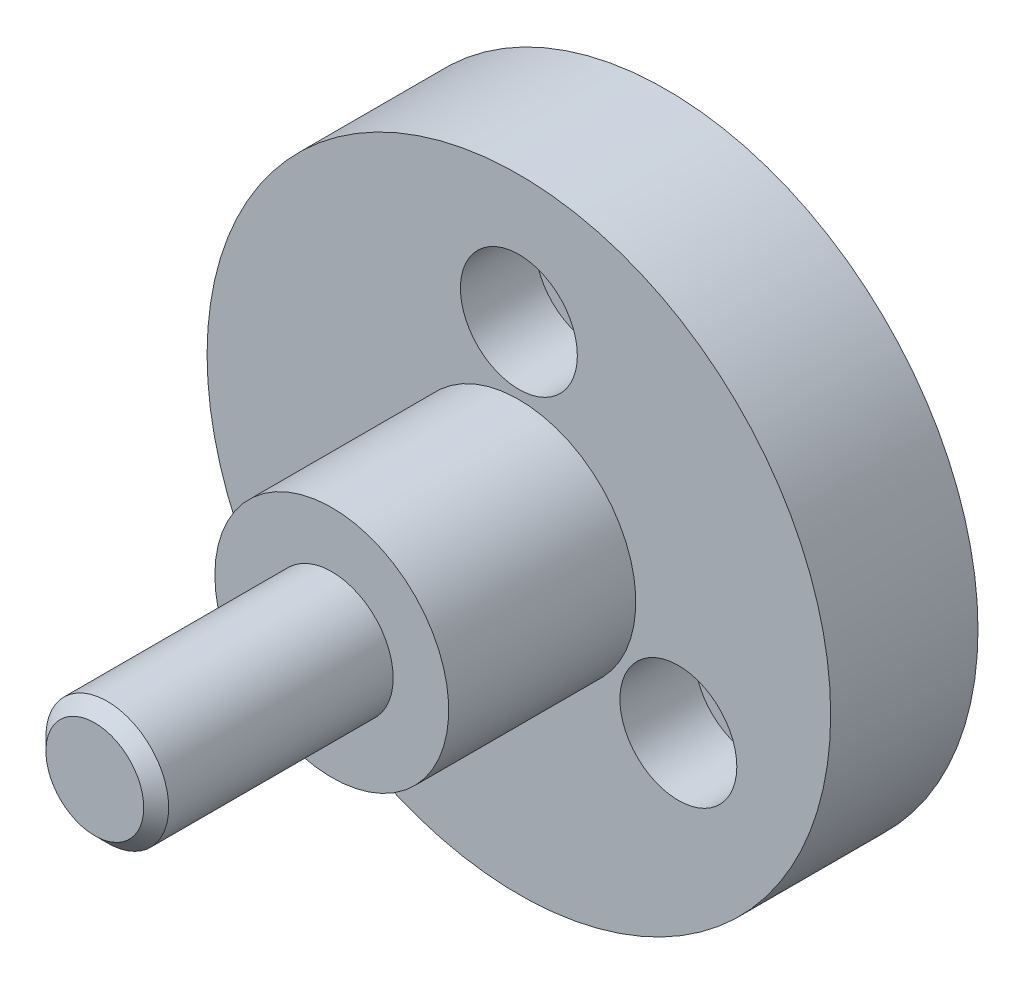
ISO-10303-21;
HEADER;
FILE_DESCRIPTION(('STEP AP214'),'2;1');
FILE_NAME('part.step','',(''),(''),'','','');
FILE_SCHEMA(('AUTOMOTIVE_DESIGN { 1 0 10303 214 1 1 1 1 }'));
ENDSEC;
DATA;
#1=APPLICATION_CONTEXT('core data for automotive mechanical design processes');
#2=APPLICATION_PROTOCOL_DEFINITION('international standard','automotive_design',2000,#1);
#3=PRODUCT_CONTEXT('',#1,'mechanical');
#4=PRODUCT('Part','Part','',(#3));
#5=PRODUCT_RELATED_PRODUCT_CATEGORY('part','',(#4));
#6=PRODUCT_DEFINITION_FORMATION('','',#4);
#7=PRODUCT_DEFINITION_CONTEXT('part definition',#1,'design');
#8=PRODUCT_DEFINITION('design','',#6,#7);
#9=PRODUCT_DEFINITION_SHAPE('','',#8);
#10=(LENGTH_UNIT() NAMED_UNIT(*) SI_UNIT(.MILLI.,.METRE.));
#11=(NAMED_UNIT(*) PLANE_ANGLE_UNIT() SI_UNIT($,.RADIAN.));
#12=(NAMED_UNIT(*) SI_UNIT($,.STERADIAN.) SOLID_ANGLE_UNIT());
#13=UNCERTAINTY_MEASURE_WITH_UNIT(LENGTH_MEASURE(1.E-05),#10,'distance_accuracy_value','');
#14=(GEOMETRIC_REPRESENTATION_CONTEXT(3) GLOBAL_UNCERTAINTY_ASSIGNED_CONTEXT((#13)) GLOBAL_UNIT_ASSIGNED_CONTEXT((#10,
#11,#12)) REPRESENTATION_CONTEXT('',''));
#15=CARTESIAN_POINT('',(0.,0.,0.));
#16=DIRECTION('',(0.,0.,1.));
#17=DIRECTION('',(1.,0.,0.));
#18=AXIS2_PLACEMENT_3D('',#15,#16,#17);
#19=CARTESIAN_POINT('',(6.49519052838332,-3.74999999999994,6.));
#20=DIRECTION('',(0.,0.,1.));
#21=DIRECTION('',(1.,0.,0.));
#22=AXIS2_PLACEMENT_3D('',#19,#20,#21);
#23=CYLINDRICAL_SURFACE('',#22,1.45);
#24=CARTESIAN_POINT('',(6.49519052838332,-3.74999999999994,2.54));
#25=DIRECTION('',(0.,0.,-1.));
#26=DIRECTION('',(-1.,0.,0.));
#27=AXIS2_PLACEMENT_3D('',#24,#25,#26);
#28=CIRCLE('',#27,1.45);
#29=CARTESIAN_POINT('',(5.0487356996428,-3.85133325423187,2.54));
#30=VERTEX_POINT('',#29);
#31=CARTESIAN_POINT('',(5.85972028642604,-2.44666674576802,2.54));
#32=VERTEX_POINT('',#31);
#33=EDGE_CURVE('E109',#30,#32,#28,.T.);
#34=ORIENTED_EDGE('',*,*,#33,.T.);
#35=DIRECTION('',(0.,0.,1.));
#36=VECTOR('',#35,1.);
#37=CARTESIAN_POINT('',(5.85972028642604,-2.44666674576803,3.));
#38=LINE('',#37,#36);
#39=CARTESIAN_POINT('',(5.85972028642604,-2.44666674576802,0.));
#40=VERTEX_POINT('',#39);
#41=EDGE_CURVE('E63',#40,#32,#38,.T.);
#42=ORIENTED_EDGE('',*,*,#41,.F.);
#43=CARTESIAN_POINT('',(6.49519052838332,-3.74999999999994,0.));
#44=DIRECTION('',(0.,0.,1.));
#45=DIRECTION('',(1.,0.,0.));
#46=AXIS2_PLACEMENT_3D('',#43,#44,#45);
#47=CIRCLE('',#46,1.45);
#48=CARTESIAN_POINT('',(5.04873569964281,-3.85133325423187,0.));
#49=VERTEX_POINT('',#48);
#50=EDGE_CURVE('E13',#49,#40,#47,.T.);
#51=ORIENTED_EDGE('',*,*,#50,.F.);
#52=DIRECTION('',(0.,0.,1.));
#53=VECTOR('',#52,1.);
#54=CARTESIAN_POINT('',(5.04873569964281,-3.85133325423187,3.));
#55=LINE('',#54,#53);
#56=EDGE_CURVE('E100',#30,#49,#55,.F.);
#57=ORIENTED_EDGE('',*,*,#56,.F.);
#58=EDGE_LOOP('',(#34,#42,#51,#57));
#59=FACE_BOUND('',#58,.T.);
#60=CARTESIAN_POINT('',(6.49519052838332,-3.74999999999994,2.952));
#61=DIRECTION('',(0.,0.,1.));
#62=DIRECTION('',(1.,0.,0.));
#63=AXIS2_PLACEMENT_3D('',#60,#61,#62);
#64=CIRCLE('',#63,1.45);
#65=CARTESIAN_POINT('',(7.94519052838332,-3.74999999999994,2.952));
#66=VERTEX_POINT('',#65);
#67=EDGE_CURVE('E50',#66,#66,#64,.F.);
#68=ORIENTED_EDGE('',*,*,#67,.F.);
#69=EDGE_LOOP('',(#68));
#70=FACE_BOUND('',#69,.T.);
#71=ADVANCED_FACE('F46',(#59,#70),#23,.F.);
#72=CARTESIAN_POINT('',(-6.49519052838327,-3.75000000000003,6.));
#73=DIRECTION('',(0.,0.,1.));
#74=DIRECTION('',(1.,0.,0.));
#75=AXIS2_PLACEMENT_3D('',#72,#73,#74);
#76=CYLINDRICAL_SURFACE('',#75,1.45);
#77=CARTESIAN_POINT('',(-6.49519052838327,-3.75000000000003,2.54));
#78=DIRECTION('',(0.,0.,-1.));
#79=DIRECTION('',(-1.,0.,0.));
#80=AXIS2_PLACEMENT_3D('',#77,#78,#79);
#81=CIRCLE('',#80,1.45);
#82=CARTESIAN_POINT('',(-5.85972028642601,-2.44666674576811,2.54));
#83=VERTEX_POINT('',#82);
#84=CARTESIAN_POINT('',(-5.04873569964275,-3.85133325423195,2.54));
#85=VERTEX_POINT('',#84);
#86=EDGE_CURVE('E166',#83,#85,#81,.T.);
#87=ORIENTED_EDGE('',*,*,#86,.T.);
#88=DIRECTION('',(0.,0.,1.));
#89=VECTOR('',#88,1.);
#90=CARTESIAN_POINT('',(-5.04873569964275,-3.85133325423194,3.));
#91=LINE('',#90,#89);
#92=CARTESIAN_POINT('',(-5.04873569964275,-3.85133325423194,0.));
#93=VERTEX_POINT('',#92);
#94=EDGE_CURVE('E108',#93,#85,#91,.T.);
#95=ORIENTED_EDGE('',*,*,#94,.F.);
#96=CARTESIAN_POINT('',(-6.49519052838327,-3.75000000000003,0.));
#97=DIRECTION('',(0.,0.,1.));
#98=DIRECTION('',(1.,0.,0.));
#99=AXIS2_PLACEMENT_3D('',#96,#97,#98);
#100=CIRCLE('',#99,1.45);
#101=CARTESIAN_POINT('',(-5.85972028642601,-2.44666674576811,0.));
#102=VERTEX_POINT('',#101);
#103=EDGE_CURVE('E55',#102,#93,#100,.T.);
#104=ORIENTED_EDGE('',*,*,#103,.F.);
#105=DIRECTION('',(0.,0.,1.));
#106=VECTOR('',#105,1.);
#107=CARTESIAN_POINT('',(-5.85972028642601,-2.44666674576811,3.));
#108=LINE('',#107,#106);
#109=EDGE_CURVE('E169',#83,#102,#108,.F.);
#110=ORIENTED_EDGE('',*,*,#109,.F.);
#111=EDGE_LOOP('',(#87,#95,#104,#110));
#112=FACE_BOUND('',#111,.T.);
#113=CARTESIAN_POINT('',(-6.49519052838327,-3.75000000000003,2.952));
#114=DIRECTION('',(0.,0.,1.));
#115=DIRECTION('',(1.,0.,0.));
#116=AXIS2_PLACEMENT_3D('',#113,#114,#115);
#117=CIRCLE('',#116,1.45);
#118=CARTESIAN_POINT('',(-5.04519052838327,-3.75000000000003,2.952));
#119=VERTEX_POINT('',#118);
#120=EDGE_CURVE('E147',#119,#119,#117,.F.);
#121=ORIENTED_EDGE('',*,*,#120,.F.);
#122=EDGE_LOOP('',(#121));
#123=FACE_BOUND('',#122,.T.);
#124=ADVANCED_FACE('F215',(#112,#123),#76,.F.);
#125=CARTESIAN_POINT('',(0.,0.,2.54));
#126=DIRECTION('',(0.,0.,-1.));
#127=DIRECTION('',(-1.,0.,0.));
#128=AXIS2_PLACEMENT_3D('',#125,#126,#127);
#129=CYLINDRICAL_SURFACE('',#128,6.35);
#130=CARTESIAN_POINT('',(0.,0.,2.54));
#131=DIRECTION('',(0.,0.,-1.));
#132=DIRECTION('',(-1.,0.,0.));
#133=AXIS2_PLACEMENT_3D('',#130,#131,#132);
#134=CIRCLE('',#133,6.35);
#135=EDGE_CURVE('E107',#30,#85,#134,.T.);
#136=ORIENTED_EDGE('',*,*,#135,.F.);
#137=ORIENTED_EDGE('',*,*,#56,.T.);
#138=CARTESIAN_POINT('',(0.,0.,0.));
#139=DIRECTION('',(0.,0.,-1.));
#140=DIRECTION('',(-1.,0.,0.));
#141=AXIS2_PLACEMENT_3D('',#138,#139,#140);
#142=CIRCLE('',#141,6.35);
#143=EDGE_CURVE('E70',#49,#93,#142,.T.);
#144=ORIENTED_EDGE('',*,*,#143,.T.);
#145=ORIENTED_EDGE('',*,*,#94,.T.);
#146=EDGE_LOOP('',(#136,#137,#144,#145));
#147=FACE_BOUND('',#146,.T.);
#148=ADVANCED_FACE('F106',(#147),#129,.F.);
#149=CARTESIAN_POINT('',(-0.810984586783251,6.298,2.54));
#150=VERTEX_POINT('',#149);
#151=EDGE_CURVE('E118',#83,#150,#134,.T.);
#152=ORIENTED_EDGE('',*,*,#151,.F.);
#153=ORIENTED_EDGE('',*,*,#109,.T.);
#154=CARTESIAN_POINT('',(-0.810984586783252,6.298,0.));
#155=VERTEX_POINT('',#154);
#156=EDGE_CURVE('E116',#102,#155,#142,.T.);
#157=ORIENTED_EDGE('',*,*,#156,.T.);
#158=DIRECTION('',(0.,0.,1.));
#159=VECTOR('',#158,1.);
#160=CARTESIAN_POINT('',(-0.810984586783251,6.298,3.));
#161=LINE('',#160,#159);
#162=EDGE_CURVE('E145',#155,#150,#161,.T.);
#163=ORIENTED_EDGE('',*,*,#162,.T.);
#164=EDGE_LOOP('',(#152,#153,#157,#163));
#165=FACE_BOUND('',#164,.T.);
#166=ADVANCED_FACE('F213',(#165),#129,.F.);
#167=CARTESIAN_POINT('',(0.,7.5,6.));
#168=DIRECTION('',(0.,0.,1.));
#169=DIRECTION('',(1.,0.,0.));
#170=AXIS2_PLACEMENT_3D('',#167,#168,#169);
#171=CYLINDRICAL_SURFACE('',#170,1.45);
#172=CARTESIAN_POINT('',(0.,7.5,2.54));
#173=DIRECTION('',(0.,0.,-1.));
#174=DIRECTION('',(-1.,0.,0.));
#175=AXIS2_PLACEMENT_3D('',#172,#173,#174);
#176=CIRCLE('',#175,1.45);
#177=CARTESIAN_POINT('',(0.810984586783252,6.298,2.54));
#178=VERTEX_POINT('',#177);
#179=EDGE_CURVE('E179',#178,#150,#176,.T.);
#180=ORIENTED_EDGE('',*,*,#179,.T.);
#181=ORIENTED_EDGE('',*,*,#162,.F.);
#182=CARTESIAN_POINT('',(0.,7.5,0.));
#183=DIRECTION('',(0.,0.,1.));
#184=DIRECTION('',(1.,0.,0.));
#185=AXIS2_PLACEMENT_3D('',#182,#183,#184);
#186=CIRCLE('',#185,1.45);
#187=CARTESIAN_POINT('',(0.810984586783251,6.298,0.));
#188=VERTEX_POINT('',#187);
#189=EDGE_CURVE('E136',#188,#155,#186,.T.);
#190=ORIENTED_EDGE('',*,*,#189,.F.);
#191=DIRECTION('',(0.,0.,1.));
#192=VECTOR('',#191,1.);
#193=CARTESIAN_POINT('',(0.810984586783251,6.298,3.));
#194=LINE('',#193,#192);
#195=EDGE_CURVE('E182',#178,#188,#194,.F.);
#196=ORIENTED_EDGE('',*,*,#195,.F.);
#197=EDGE_LOOP('',(#180,#181,#190,#196));
#198=FACE_BOUND('',#197,.T.);
#199=CARTESIAN_POINT('',(0.,7.5,2.952));
#200=DIRECTION('',(0.,0.,1.));
#201=DIRECTION('',(1.,0.,0.));
#202=AXIS2_PLACEMENT_3D('',#199,#200,#201);
#203=CIRCLE('',#202,1.45);
#204=CARTESIAN_POINT('',(1.45,7.5,2.952));
#205=VERTEX_POINT('',#204);
#206=EDGE_CURVE('E142',#205,#205,#203,.F.);
#207=ORIENTED_EDGE('',*,*,#206,.F.);
#208=EDGE_LOOP('',(#207));
#209=FACE_BOUND('',#208,.T.);
#210=ADVANCED_FACE('F202',(#198,#209),#171,.F.);
#211=CARTESIAN_POINT('',(0.,0.,6.));
#212=DIRECTION('',(0.,0.,-1.));
#213=DIRECTION('',(-1.,0.,0.));
#214=AXIS2_PLACEMENT_3D('',#211,#212,#213);
#215=CYLINDRICAL_SURFACE('',#214,12.7);
#216=CARTESIAN_POINT('',(0.,0.,6.));
#217=DIRECTION('',(0.,0.,1.));
#218=DIRECTION('',(1.,0.,0.));
#219=AXIS2_PLACEMENT_3D('',#216,#217,#218);
#220=CIRCLE('',#219,12.7);
#221=CARTESIAN_POINT('',(12.7,0.,6.));
#222=VERTEX_POINT('',#221);
#223=EDGE_CURVE('E124',#222,#222,#220,.T.);
#224=ORIENTED_EDGE('',*,*,#223,.F.);
#225=EDGE_LOOP('',(#224));
#226=FACE_BOUND('',#225,.T.);
#227=CARTESIAN_POINT('',(0.,0.,0.));
#228=DIRECTION('',(0.,0.,1.));
#229=DIRECTION('',(1.,0.,0.));
#230=AXIS2_PLACEMENT_3D('',#227,#228,#229);
#231=CIRCLE('',#230,12.7);
#232=CARTESIAN_POINT('',(12.7,0.,0.));
#233=VERTEX_POINT('',#232);
#234=EDGE_CURVE('E128',#233,#233,#231,.T.);
#235=ORIENTED_EDGE('',*,*,#234,.T.);
#236=EDGE_LOOP('',(#235));
#237=FACE_BOUND('',#236,.T.);
#238=ADVANCED_FACE('F195',(#226,#237),#215,.T.);
#239=CARTESIAN_POINT('',(0.,0.,6.));
#240=DIRECTION('',(0.,0.,1.));
#241=DIRECTION('',(1.,0.,0.));
#242=AXIS2_PLACEMENT_3D('',#239,#240,#241);
#243=PLANE('',#242);
#244=CARTESIAN_POINT('',(6.49519052838332,-3.74999999999994,6.));
#245=DIRECTION('',(0.,0.,1.));
#246=DIRECTION('',(-0.499999999999992,-0.866025403784443,0.));
#247=AXIS2_PLACEMENT_3D('',#244,#245,#246);
#248=CIRCLE('',#247,2.38125);
#249=CARTESIAN_POINT('',(8.87644052838332,-3.74999999999994,6.));
#250=VERTEX_POINT('',#249);
#251=EDGE_CURVE('E161',#250,#250,#248,.T.);
#252=ORIENTED_EDGE('',*,*,#251,.F.);
#253=EDGE_LOOP('',(#252));
#254=FACE_BOUND('',#253,.T.);
#255=CARTESIAN_POINT('',(-6.49519052838327,-3.75000000000003,6.));
#256=DIRECTION('',(0.,0.,1.));
#257=DIRECTION('',(-0.500000000000004,0.866025403784436,0.));
#258=AXIS2_PLACEMENT_3D('',#255,#256,#257);
#259=CIRCLE('',#258,2.38125);
#260=CARTESIAN_POINT('',(-4.11394052838327,-3.75000000000003,6.));
#261=VERTEX_POINT('',#260);
#262=EDGE_CURVE('E154',#261,#261,#259,.T.);
#263=ORIENTED_EDGE('',*,*,#262,.F.);
#264=EDGE_LOOP('',(#263));
#265=FACE_BOUND('',#264,.T.);
#266=CARTESIAN_POINT('',(0.,7.5,6.));
#267=DIRECTION('',(0.,0.,1.));
#268=DIRECTION('',(1.,0.,0.));
#269=AXIS2_PLACEMENT_3D('',#266,#267,#268);
#270=CIRCLE('',#269,2.38125);
#271=CARTESIAN_POINT('',(2.38125,7.5,6.));
#272=VERTEX_POINT('',#271);
#273=EDGE_CURVE('E172',#272,#272,#270,.T.);
#274=ORIENTED_EDGE('',*,*,#273,.F.);
#275=EDGE_LOOP('',(#274));
#276=FACE_BOUND('',#275,.T.);
#277=CARTESIAN_POINT('',(0.,0.,6.));
#278=DIRECTION('',(0.,0.,1.));
#279=DIRECTION('',(1.,0.,0.));
#280=AXIS2_PLACEMENT_3D('',#277,#278,#279);
#281=CIRCLE('',#280,4.7625);
#282=CARTESIAN_POINT('',(-4.7625,0.,6.));
#283=VERTEX_POINT('',#282);
#284=EDGE_CURVE('E185',#283,#283,#281,.T.);
#285=ORIENTED_EDGE('',*,*,#284,.F.);
#286=EDGE_LOOP('',(#285));
#287=FACE_BOUND('',#286,.T.);
#288=ORIENTED_EDGE('',*,*,#223,.T.);
#289=EDGE_LOOP('',(#288));
#290=FACE_BOUND('',#289,.T.);
#291=ADVANCED_FACE('F192',(#254,#265,#276,#287,#290),#243,.T.);
#292=CARTESIAN_POINT('',(0.,0.,0.));
#293=DIRECTION('',(0.,0.,1.));
#294=DIRECTION('',(1.,0.,0.));
#295=AXIS2_PLACEMENT_3D('',#292,#293,#294);
#296=PLANE('',#295);
#297=ORIENTED_EDGE('',*,*,#143,.F.);
#298=ORIENTED_EDGE('',*,*,#50,.T.);
#299=EDGE_CURVE('E115',#188,#40,#142,.T.);
#300=ORIENTED_EDGE('',*,*,#299,.F.);
#301=ORIENTED_EDGE('',*,*,#189,.T.);
#302=ORIENTED_EDGE('',*,*,#156,.F.);
#303=ORIENTED_EDGE('',*,*,#103,.T.);
#304=EDGE_LOOP('',(#297,#298,#300,#301,#302,#303));
#305=FACE_BOUND('',#304,.T.);
#306=ORIENTED_EDGE('',*,*,#234,.F.);
#307=EDGE_LOOP('',(#306));
#308=FACE_BOUND('',#307,.T.);
#309=ADVANCED_FACE('F112',(#305,#308),#296,.F.);
#310=ORIENTED_EDGE('',*,*,#299,.T.);
#311=ORIENTED_EDGE('',*,*,#41,.T.);
#312=EDGE_CURVE('E122',#178,#32,#134,.T.);
#313=ORIENTED_EDGE('',*,*,#312,.F.);
#314=ORIENTED_EDGE('',*,*,#195,.T.);
#315=EDGE_LOOP('',(#310,#311,#313,#314));
#316=FACE_BOUND('',#315,.T.);
#317=ADVANCED_FACE('F205',(#316),#129,.F.);
#318=CARTESIAN_POINT('',(0.,0.,2.54));
#319=DIRECTION('',(0.,0.,-1.));
#320=DIRECTION('',(-1.,0.,0.));
#321=AXIS2_PLACEMENT_3D('',#318,#319,#320);
#322=PLANE('',#321);
#323=ORIENTED_EDGE('',*,*,#33,.F.);
#324=ORIENTED_EDGE('',*,*,#135,.T.);
#325=ORIENTED_EDGE('',*,*,#86,.F.);
#326=ORIENTED_EDGE('',*,*,#151,.T.);
#327=ORIENTED_EDGE('',*,*,#179,.F.);
#328=ORIENTED_EDGE('',*,*,#312,.T.);
#329=EDGE_LOOP('',(#323,#324,#325,#326,#327,#328));
#330=FACE_BOUND('',#329,.T.);
#331=ADVANCED_FACE('F210',(#330),#322,.T.);
#332=CARTESIAN_POINT('',(0.,0.,13.62));
#333=DIRECTION('',(0.,0.,-1.));
#334=DIRECTION('',(-1.,0.,0.));
#335=AXIS2_PLACEMENT_3D('',#332,#333,#334);
#336=CYLINDRICAL_SURFACE('',#335,4.7625);
#337=CARTESIAN_POINT('',(0.,0.,13.62));
#338=DIRECTION('',(0.,0.,1.));
#339=DIRECTION('',(1.,0.,0.));
#340=AXIS2_PLACEMENT_3D('',#337,#338,#339);
#341=CIRCLE('',#340,4.7625);
#342=CARTESIAN_POINT('',(-4.7625,0.,13.62));
#343=VERTEX_POINT('',#342);
#344=EDGE_CURVE('E139',#343,#343,#341,.T.);
#345=CARTESIAN_POINT('',(-4.7625,0.,13.62));
#346=CARTESIAN_POINT('',(-4.7625,0.,13.540625));
#347=CARTESIAN_POINT('',(-4.7625,0.,13.46125));
#348=CARTESIAN_POINT('',(-4.7625,0.,13.3025));
#349=CARTESIAN_POINT('',(-4.7625,0.,13.223125));
#350=CARTESIAN_POINT('',(-4.7625,0.,13.064375));
#351=CARTESIAN_POINT('',(-4.7625,0.,12.985));
#352=CARTESIAN_POINT('',(-4.7625,0.,12.82625));
#353=CARTESIAN_POINT('',(-4.7625,0.,12.746875));
#354=CARTESIAN_POINT('',(-4.7625,0.,12.588125));
#355=CARTESIAN_POINT('',(-4.7625,0.,12.50875));
#356=CARTESIAN_POINT('',(-4.7625,0.,12.35));
#357=CARTESIAN_POINT('',(-4.7625,0.,12.270625));
#358=CARTESIAN_POINT('',(-4.7625,0.,12.111875));
#359=CARTESIAN_POINT('',(-4.7625,0.,12.0325));
#360=CARTESIAN_POINT('',(-4.7625,0.,11.87375));
#361=CARTESIAN_POINT('',(-4.7625,0.,11.794375));
#362=CARTESIAN_POINT('',(-4.7625,0.,11.635625));
#363=CARTESIAN_POINT('',(-4.7625,0.,11.55625));
#364=CARTESIAN_POINT('',(-4.7625,0.,11.3975));
#365=CARTESIAN_POINT('',(-4.7625,0.,11.318125));
#366=CARTESIAN_POINT('',(-4.7625,0.,11.159375));
#367=CARTESIAN_POINT('',(-4.7625,0.,11.08));
#368=CARTESIAN_POINT('',(-4.7625,0.,10.92125));
#369=CARTESIAN_POINT('',(-4.7625,0.,10.841875));
#370=CARTESIAN_POINT('',(-4.7625,0.,10.683125));
#371=CARTESIAN_POINT('',(-4.7625,0.,10.60375));
#372=CARTESIAN_POINT('',(-4.7625,0.,10.445));
#373=CARTESIAN_POINT('',(-4.7625,0.,10.365625));
#374=CARTESIAN_POINT('',(-4.7625,0.,10.206875));
#375=CARTESIAN_POINT('',(-4.7625,0.,10.1275));
#376=CARTESIAN_POINT('',(-4.7625,0.,9.96875));
#377=CARTESIAN_POINT('',(-4.7625,0.,9.889375));
#378=CARTESIAN_POINT('',(-4.7625,0.,9.730625));
#379=CARTESIAN_POINT('',(-4.7625,0.,9.65125));
#380=CARTESIAN_POINT('',(-4.7625,0.,9.4925));
#381=CARTESIAN_POINT('',(-4.7625,0.,9.413125));
#382=CARTESIAN_POINT('',(-4.7625,0.,9.254375));
#383=CARTESIAN_POINT('',(-4.7625,0.,9.175));
#384=CARTESIAN_POINT('',(-4.7625,0.,9.01625));
#385=CARTESIAN_POINT('',(-4.7625,0.,8.936875));
#386=CARTESIAN_POINT('',(-4.7625,0.,8.778125));
#387=CARTESIAN_POINT('',(-4.7625,0.,8.69875));
#388=CARTESIAN_POINT('',(-4.7625,0.,8.54));
#389=CARTESIAN_POINT('',(-4.7625,0.,8.460625));
#390=CARTESIAN_POINT('',(-4.7625,0.,8.301875));
#391=CARTESIAN_POINT('',(-4.7625,0.,8.2225));
#392=CARTESIAN_POINT('',(-4.7625,0.,8.06375));
#393=CARTESIAN_POINT('',(-4.7625,0.,7.984375));
#394=CARTESIAN_POINT('',(-4.7625,0.,7.825625));
#395=CARTESIAN_POINT('',(-4.7625,0.,7.74625));
#396=CARTESIAN_POINT('',(-4.7625,0.,7.5875));
#397=CARTESIAN_POINT('',(-4.7625,0.,7.508125));
#398=CARTESIAN_POINT('',(-4.7625,0.,7.349375));
#399=CARTESIAN_POINT('',(-4.7625,0.,7.27));
#400=CARTESIAN_POINT('',(-4.7625,0.,7.11125));
#401=CARTESIAN_POINT('',(-4.7625,0.,7.031875));
#402=CARTESIAN_POINT('',(-4.7625,0.,6.873125));
#403=CARTESIAN_POINT('',(-4.7625,0.,6.79375));
#404=CARTESIAN_POINT('',(-4.7625,0.,6.635));
#405=CARTESIAN_POINT('',(-4.7625,0.,6.555625));
#406=CARTESIAN_POINT('',(-4.7625,0.,6.396875));
#407=CARTESIAN_POINT('',(-4.7625,0.,6.3175));
#408=CARTESIAN_POINT('',(-4.7625,0.,6.15875));
#409=CARTESIAN_POINT('',(-4.7625,0.,6.079375));
#410=CARTESIAN_POINT('',(-4.7625,0.,6.));
#411=B_SPLINE_CURVE_WITH_KNOTS('',3,(#345,#346,#347,#348,#349,#350,#351,#352,#353,#354,#355,
#356,#357,#358,#359,#360,#361,#362,#363,#364,#365,#366,#367,#368,#369,#370,#371,#372,#373,#374,
#375,#376,#377,#378,#379,#380,#381,#382,#383,#384,#385,#386,#387,#388,#389,#390,#391,#392,#393,
#394,#395,#396,#397,#398,#399,#400,#401,#402,#403,#404,#405,#406,#407,#408,#409,#410),
.UNSPECIFIED.,.F.,.F.,(4,2,2,2,2,2,2,2,2,2,2,2,2,2,2,2,2,2,2,2,2,2,2,2,2,2,2,2,2,2,2,2,4),(0.,
0.238124999999999,0.476249999999999,0.714375,0.952499999999998,1.190625,1.42875,1.666875,1.905,
2.143125,2.38125,2.619375,2.8575,3.095625,3.33375,3.571875,3.81,4.048125,4.28625,4.524375,
4.7625,5.000625,5.23875,5.476875,5.715,5.953125,6.19125,6.429375,6.6675,6.905625,7.14375,
7.381875,7.62),.UNSPECIFIED.);
#412=EDGE_CURVE('BSEAM190',#343,#283,#411,.T.);
#413=ORIENTED_EDGE('',*,*,#344,.F.);
#414=ORIENTED_EDGE('',*,*,#284,.T.);
#415=ORIENTED_EDGE('',*,*,#412,.T.);
#416=ORIENTED_EDGE('',*,*,#412,.F.);
#417=EDGE_LOOP('',(#413,#415,#414,#416));
#418=FACE_BOUND('',#417,.T.);
#419=ADVANCED_FACE('F190',(#418),#336,.T.);
#420=CARTESIAN_POINT('',(0.,0.,13.62));
#421=DIRECTION('',(0.,0.,1.));
#422=DIRECTION('',(1.,0.,0.));
#423=AXIS2_PLACEMENT_3D('',#420,#421,#422);
#424=PLANE('',#423);
#425=CARTESIAN_POINT('',(0.,0.,13.62));
#426=DIRECTION('',(0.,0.,1.));
#427=DIRECTION('',(1.,0.,0.));
#428=AXIS2_PLACEMENT_3D('',#425,#426,#427);
#429=CIRCLE('',#428,2.5);
#430=CARTESIAN_POINT('',(2.5,0.,13.62));
#431=VERTEX_POINT('',#430);
#432=EDGE_CURVE('E119',#431,#431,#429,.T.);
#433=ORIENTED_EDGE('',*,*,#432,.F.);
#434=EDGE_LOOP('',(#433));
#435=FACE_BOUND('',#434,.T.);
#436=ORIENTED_EDGE('',*,*,#344,.T.);
#437=EDGE_LOOP('',(#436));
#438=FACE_BOUND('',#437,.T.);
#439=ADVANCED_FACE('F239',(#435,#438),#424,.T.);
#440=CARTESIAN_POINT('',(0.,0.,23.272));
#441=DIRECTION('',(0.,0.,1.));
#442=DIRECTION('',(1.,0.,0.));
#443=AXIS2_PLACEMENT_3D('',#440,#441,#442);
#444=PLANE('',#443);
#445=CARTESIAN_POINT('',(0.,0.,23.272));
#446=DIRECTION('',(0.,0.,1.));
#447=DIRECTION('',(1.,0.,0.));
#448=AXIS2_PLACEMENT_3D('',#445,#446,#447);
#449=CIRCLE('',#448,1.99200000000001);
#450=CARTESIAN_POINT('',(1.99200000000001,0.,23.272));
#451=VERTEX_POINT('',#450);
#452=EDGE_CURVE('E127',#451,#451,#449,.T.);
#453=ORIENTED_EDGE('',*,*,#452,.T.);
#454=EDGE_LOOP('',(#453));
#455=FACE_BOUND('',#454,.T.);
#456=ADVANCED_FACE('F242',(#455),#444,.T.);
#457=CARTESIAN_POINT('',(0.,0.,23.272));
#458=DIRECTION('',(0.,0.,-1.));
#459=DIRECTION('',(-1.,0.,0.));
#460=AXIS2_PLACEMENT_3D('',#457,#458,#459);
#461=CONICAL_SURFACE('',#460,1.99200000000001,0.785398163397443);
#462=CARTESIAN_POINT('',(0.,0.,22.764));
#463=DIRECTION('',(0.,0.,1.));
#464=DIRECTION('',(1.,0.,0.));
#465=AXIS2_PLACEMENT_3D('',#462,#463,#464);
#466=CIRCLE('',#465,2.5);
#467=CARTESIAN_POINT('',(2.5,0.,22.764));
#468=VERTEX_POINT('',#467);
#469=EDGE_CURVE('E133',#468,#468,#466,.F.);
#470=ORIENTED_EDGE('',*,*,#469,.F.);
#471=EDGE_LOOP('',(#470));
#472=FACE_BOUND('',#471,.T.);
#473=ORIENTED_EDGE('',*,*,#452,.F.);
#474=EDGE_LOOP('',(#473));
#475=FACE_BOUND('',#474,.T.);
#476=ADVANCED_FACE('F48',(#472,#475),#461,.T.);
#477=CARTESIAN_POINT('',(0.,0.,23.272));
#478=DIRECTION('',(0.,0.,-1.));
#479=DIRECTION('',(-1.,0.,0.));
#480=AXIS2_PLACEMENT_3D('',#477,#478,#479);
#481=CYLINDRICAL_SURFACE('',#480,2.5);
#482=ORIENTED_EDGE('',*,*,#432,.T.);
#483=EDGE_LOOP('',(#482));
#484=FACE_BOUND('',#483,.T.);
#485=ORIENTED_EDGE('',*,*,#469,.T.);
#486=EDGE_LOOP('',(#485));
#487=FACE_BOUND('',#486,.T.);
#488=ADVANCED_FACE('F230',(#484,#487),#481,.T.);
#489=CARTESIAN_POINT('',(0.,7.5,2.952));
#490=DIRECTION('',(0.,0.,1.));
#491=DIRECTION('',(1.,0.,0.));
#492=AXIS2_PLACEMENT_3D('',#489,#490,#491);
#493=PLANE('',#492);
#494=CARTESIAN_POINT('',(0.,7.5,2.952));
#495=DIRECTION('',(0.,0.,1.));
#496=DIRECTION('',(1.,0.,0.));
#497=AXIS2_PLACEMENT_3D('',#494,#495,#496);
#498=CIRCLE('',#497,2.38125);
#499=CARTESIAN_POINT('',(2.38125,7.5,2.952));
#500=VERTEX_POINT('',#499);
#501=EDGE_CURVE('E146',#500,#500,#498,.T.);
#502=ORIENTED_EDGE('',*,*,#501,.T.);
#503=EDGE_LOOP('',(#502));
#504=FACE_BOUND('',#503,.T.);
#505=ORIENTED_EDGE('',*,*,#206,.T.);
#506=EDGE_LOOP('',(#505));
#507=FACE_BOUND('',#506,.T.);
#508=ADVANCED_FACE('F226',(#504,#507),#493,.T.);
#509=CARTESIAN_POINT('',(0.,7.5,2.952));
#510=DIRECTION('',(0.,0.,1.));
#511=DIRECTION('',(1.,0.,0.));
#512=AXIS2_PLACEMENT_3D('',#509,#510,#511);
#513=CYLINDRICAL_SURFACE('',#512,2.38125);
#514=CARTESIAN_POINT('',(2.38125,7.5,2.952));
#515=CARTESIAN_POINT('',(2.38125,7.5,2.98375));
#516=CARTESIAN_POINT('',(2.38125,7.5,3.0155));
#517=CARTESIAN_POINT('',(2.38125,7.5,3.079));
#518=CARTESIAN_POINT('',(2.38125,7.5,3.11075));
#519=CARTESIAN_POINT('',(2.38125,7.5,3.17425));
#520=CARTESIAN_POINT('',(2.38125,7.5,3.206));
#521=CARTESIAN_POINT('',(2.38125,7.5,3.2695));
#522=CARTESIAN_POINT('',(2.38125,7.5,3.30125));
#523=CARTESIAN_POINT('',(2.38125,7.5,3.36475));
#524=CARTESIAN_POINT('',(2.38125,7.5,3.3965));
#525=CARTESIAN_POINT('',(2.38125,7.5,3.46));
#526=CARTESIAN_POINT('',(2.38125,7.5,3.49175));
#527=CARTESIAN_POINT('',(2.38125,7.5,3.55525));
#528=CARTESIAN_POINT('',(2.38125,7.5,3.587));
#529=CARTESIAN_POINT('',(2.38125,7.5,3.6505));
#530=CARTESIAN_POINT('',(2.38125,7.5,3.68225));
#531=CARTESIAN_POINT('',(2.38125,7.5,3.74575));
#532=CARTESIAN_POINT('',(2.38125,7.5,3.7775));
#533=CARTESIAN_POINT('',(2.38125,7.5,3.841));
#534=CARTESIAN_POINT('',(2.38125,7.5,3.87275));
#535=CARTESIAN_POINT('',(2.38125,7.5,3.93625));
#536=CARTESIAN_POINT('',(2.38125,7.5,3.968));
#537=CARTESIAN_POINT('',(2.38125,7.5,4.0315));
#538=CARTESIAN_POINT('',(2.38125,7.5,4.06325));
#539=CARTESIAN_POINT('',(2.38125,7.5,4.12675));
#540=CARTESIAN_POINT('',(2.38125,7.5,4.1585));
#541=CARTESIAN_POINT('',(2.38125,7.5,4.222));
#542=CARTESIAN_POINT('',(2.38125,7.5,4.25375));
#543=CARTESIAN_POINT('',(2.38125,7.5,4.31725));
#544=CARTESIAN_POINT('',(2.38125,7.5,4.349));
#545=CARTESIAN_POINT('',(2.38125,7.5,4.4125));
#546=CARTESIAN_POINT('',(2.38125,7.5,4.44425));
#547=CARTESIAN_POINT('',(2.38125,7.5,4.50775));
#548=CARTESIAN_POINT('',(2.38125,7.5,4.5395));
#549=CARTESIAN_POINT('',(2.38125,7.5,4.603));
#550=CARTESIAN_POINT('',(2.38125,7.5,4.63475));
#551=CARTESIAN_POINT('',(2.38125,7.5,4.69825));
#552=CARTESIAN_POINT('',(2.38125,7.5,4.73));
#553=CARTESIAN_POINT('',(2.38125,7.5,4.7935));
#554=CARTESIAN_POINT('',(2.38125,7.5,4.82525));
#555=CARTESIAN_POINT('',(2.38125,7.5,4.88875));
#556=CARTESIAN_POINT('',(2.38125,7.5,4.9205));
#557=CARTESIAN_POINT('',(2.38125,7.5,4.984));
#558=CARTESIAN_POINT('',(2.38125,7.5,5.01575));
#559=CARTESIAN_POINT('',(2.38125,7.5,5.07925));
#560=CARTESIAN_POINT('',(2.38125,7.5,5.111));
#561=CARTESIAN_POINT('',(2.38125,7.5,5.1745));
#562=CARTESIAN_POINT('',(2.38125,7.5,5.20625));
#563=CARTESIAN_POINT('',(2.38125,7.5,5.26975));
#564=CARTESIAN_POINT('',(2.38125,7.5,5.3015));
#565=CARTESIAN_POINT('',(2.38125,7.5,5.365));
#566=CARTESIAN_POINT('',(2.38125,7.5,5.39675));
#567=CARTESIAN_POINT('',(2.38125,7.5,5.46025));
#568=CARTESIAN_POINT('',(2.38125,7.5,5.492));
#569=CARTESIAN_POINT('',(2.38125,7.5,5.5555));
#570=CARTESIAN_POINT('',(2.38125,7.5,5.58725));
#571=CARTESIAN_POINT('',(2.38125,7.5,5.65075));
#572=CARTESIAN_POINT('',(2.38125,7.5,5.6825));
#573=CARTESIAN_POINT('',(2.38125,7.5,5.746));
#574=CARTESIAN_POINT('',(2.38125,7.5,5.77775));
#575=CARTESIAN_POINT('',(2.38125,7.5,5.84125));
#576=CARTESIAN_POINT('',(2.38125,7.5,5.873));
#577=CARTESIAN_POINT('',(2.38125,7.5,5.9365));
#578=CARTESIAN_POINT('',(2.38125,7.5,5.96825));
#579=CARTESIAN_POINT('',(2.38125,7.5,6.));
#580=B_SPLINE_CURVE_WITH_KNOTS('',3,(#514,#515,#516,#517,#518,#519,#520,#521,#522,#523,#524,
#525,#526,#527,#528,#529,#530,#531,#532,#533,#534,#535,#536,#537,#538,#539,#540,#541,#542,#543,
#544,#545,#546,#547,#548,#549,#550,#551,#552,#553,#554,#555,#556,#557,#558,#559,#560,#561,#562,
#563,#564,#565,#566,#567,#568,#569,#570,#571,#572,#573,#574,#575,#576,#577,#578,#579),
.UNSPECIFIED.,.F.,.F.,(4,2,2,2,2,2,2,2,2,2,2,2,2,2,2,2,2,2,2,2,2,2,2,2,2,2,2,2,2,2,2,2,4),(0.,
0.0952499999999998,0.1905,0.28575,0.381,0.47625,0.5715,0.666749999999999,0.762,0.85725,
0.952499999999999,1.04775,1.143,1.23825,1.3335,1.42875,1.524,1.61925,1.7145,1.80975,1.905,
2.00025,2.0955,2.19075,2.286,2.38125,2.4765,2.57175,2.667,2.76225,2.8575,2.95275,3.048),.UNSPECIFIED.);
#581=EDGE_CURVE('BSEAM229',#500,#272,#580,.T.);
#582=ORIENTED_EDGE('',*,*,#501,.F.);
#583=ORIENTED_EDGE('',*,*,#273,.T.);
#584=ORIENTED_EDGE('',*,*,#581,.T.);
#585=ORIENTED_EDGE('',*,*,#581,.F.);
#586=EDGE_LOOP('',(#582,#584,#583,#585));
#587=FACE_BOUND('',#586,.T.);
#588=ADVANCED_FACE('F229',(#587),#513,.F.);
#589=CARTESIAN_POINT('',(-6.49519052838327,-3.75000000000003,2.952));
#590=DIRECTION('',(0.,0.,1.));
#591=DIRECTION('',(-0.500000000000004,0.866025403784436,0.));
#592=AXIS2_PLACEMENT_3D('',#589,#590,#591);
#593=PLANE('',#592);
#594=CARTESIAN_POINT('',(-6.49519052838327,-3.75000000000003,2.952));
#595=DIRECTION('',(0.,0.,1.));
#596=DIRECTION('',(-0.500000000000004,0.866025403784436,0.));
#597=AXIS2_PLACEMENT_3D('',#594,#595,#596);
#598=CIRCLE('',#597,2.38125);
#599=CARTESIAN_POINT('',(-4.11394052838327,-3.75000000000003,2.952));
#600=VERTEX_POINT('',#599);
#601=EDGE_CURVE('E149',#600,#600,#598,.T.);
#602=ORIENTED_EDGE('',*,*,#601,.T.);
#603=EDGE_LOOP('',(#602));
#604=FACE_BOUND('',#603,.T.);
#605=ORIENTED_EDGE('',*,*,#120,.T.);
#606=EDGE_LOOP('',(#605));
#607=FACE_BOUND('',#606,.T.);
#608=ADVANCED_FACE('F234',(#604,#607),#593,.T.);
#609=CARTESIAN_POINT('',(-6.49519052838327,-3.75000000000003,2.952));
#610=DIRECTION('',(0.,0.,1.));
#611=DIRECTION('',(1.,0.,0.));
#612=AXIS2_PLACEMENT_3D('',#609,#610,#611);
#613=CYLINDRICAL_SURFACE('',#612,2.38125);
#614=CARTESIAN_POINT('',(-4.11394052838327,-3.75000000000003,2.952));
#615=CARTESIAN_POINT('',(-4.11394052838327,-3.75000000000003,2.98375));
#616=CARTESIAN_POINT('',(-4.11394052838327,-3.75000000000003,3.0155));
#617=CARTESIAN_POINT('',(-4.11394052838327,-3.75000000000003,3.079));
#618=CARTESIAN_POINT('',(-4.11394052838327,-3.75000000000003,3.11075));
#619=CARTESIAN_POINT('',(-4.11394052838327,-3.75000000000003,3.17425));
#620=CARTESIAN_POINT('',(-4.11394052838327,-3.75000000000003,3.206));
#621=CARTESIAN_POINT('',(-4.11394052838327,-3.75000000000003,3.2695));
#622=CARTESIAN_POINT('',(-4.11394052838327,-3.75000000000003,3.30125));
#623=CARTESIAN_POINT('',(-4.11394052838327,-3.75000000000003,3.36475));
#624=CARTESIAN_POINT('',(-4.11394052838327,-3.75000000000003,3.3965));
#625=CARTESIAN_POINT('',(-4.11394052838327,-3.75000000000003,3.46));
#626=CARTESIAN_POINT('',(-4.11394052838327,-3.75000000000003,3.49175));
#627=CARTESIAN_POINT('',(-4.11394052838327,-3.75000000000003,3.55525));
#628=CARTESIAN_POINT('',(-4.11394052838327,-3.75000000000003,3.587));
#629=CARTESIAN_POINT('',(-4.11394052838327,-3.75000000000003,3.6505));
#630=CARTESIAN_POINT('',(-4.11394052838327,-3.75000000000003,3.68225));
#631=CARTESIAN_POINT('',(-4.11394052838327,-3.75000000000003,3.74575));
#632=CARTESIAN_POINT('',(-4.11394052838327,-3.75000000000003,3.7775));
#633=CARTESIAN_POINT('',(-4.11394052838327,-3.75000000000003,3.841));
#634=CARTESIAN_POINT('',(-4.11394052838327,-3.75000000000003,3.87275));
#635=CARTESIAN_POINT('',(-4.11394052838327,-3.75000000000003,3.93625));
#636=CARTESIAN_POINT('',(-4.11394052838327,-3.75000000000003,3.968));
#637=CARTESIAN_POINT('',(-4.11394052838327,-3.75000000000003,4.0315));
#638=CARTESIAN_POINT('',(-4.11394052838327,-3.75000000000003,4.06325));
#639=CARTESIAN_POINT('',(-4.11394052838327,-3.75000000000003,4.12675));
#640=CARTESIAN_POINT('',(-4.11394052838327,-3.75000000000003,4.1585));
#641=CARTESIAN_POINT('',(-4.11394052838327,-3.75000000000003,4.222));
#642=CARTESIAN_POINT('',(-4.11394052838327,-3.75000000000003,4.25375));
#643=CARTESIAN_POINT('',(-4.11394052838327,-3.75000000000003,4.31725));
#644=CARTESIAN_POINT('',(-4.11394052838327,-3.75000000000003,4.349));
#645=CARTESIAN_POINT('',(-4.11394052838327,-3.75000000000003,4.4125));
#646=CARTESIAN_POINT('',(-4.11394052838327,-3.75000000000003,4.44425));
#647=CARTESIAN_POINT('',(-4.11394052838327,-3.75000000000003,4.50775));
#648=CARTESIAN_POINT('',(-4.11394052838327,-3.75000000000003,4.5395));
#649=CARTESIAN_POINT('',(-4.11394052838327,-3.75000000000003,4.603));
#650=CARTESIAN_POINT('',(-4.11394052838327,-3.75000000000003,4.63475));
#651=CARTESIAN_POINT('',(-4.11394052838327,-3.75000000000003,4.69825));
#652=CARTESIAN_POINT('',(-4.11394052838327,-3.75000000000003,4.73));
#653=CARTESIAN_POINT('',(-4.11394052838327,-3.75000000000003,4.7935));
#654=CARTESIAN_POINT('',(-4.11394052838327,-3.75000000000003,4.82525));
#655=CARTESIAN_POINT('',(-4.11394052838327,-3.75000000000003,4.88875));
#656=CARTESIAN_POINT('',(-4.11394052838327,-3.75000000000003,4.9205));
#657=CARTESIAN_POINT('',(-4.11394052838327,-3.75000000000003,4.984));
#658=CARTESIAN_POINT('',(-4.11394052838327,-3.75000000000003,5.01575));
#659=CARTESIAN_POINT('',(-4.11394052838327,-3.75000000000003,5.07925));
#660=CARTESIAN_POINT('',(-4.11394052838327,-3.75000000000003,5.111));
#661=CARTESIAN_POINT('',(-4.11394052838327,-3.75000000000003,5.1745));
#662=CARTESIAN_POINT('',(-4.11394052838327,-3.75000000000003,5.20625));
#663=CARTESIAN_POINT('',(-4.11394052838327,-3.75000000000003,5.26975));
#664=CARTESIAN_POINT('',(-4.11394052838327,-3.75000000000003,5.3015));
#665=CARTESIAN_POINT('',(-4.11394052838327,-3.75000000000003,5.365));
#666=CARTESIAN_POINT('',(-4.11394052838327,-3.75000000000003,5.39675));
#667=CARTESIAN_POINT('',(-4.11394052838327,-3.75000000000003,5.46025));
#668=CARTESIAN_POINT('',(-4.11394052838327,-3.75000000000003,5.492));
#669=CARTESIAN_POINT('',(-4.11394052838327,-3.75000000000003,5.5555));
#670=CARTESIAN_POINT('',(-4.11394052838327,-3.75000000000003,5.58725));
#671=CARTESIAN_POINT('',(-4.11394052838327,-3.75000000000003,5.65075));
#672=CARTESIAN_POINT('',(-4.11394052838327,-3.75000000000003,5.6825));
#673=CARTESIAN_POINT('',(-4.11394052838327,-3.75000000000003,5.746));
#674=CARTESIAN_POINT('',(-4.11394052838327,-3.75000000000003,5.77775));
#675=CARTESIAN_POINT('',(-4.11394052838327,-3.75000000000003,5.84125));
#676=CARTESIAN_POINT('',(-4.11394052838327,-3.75000000000003,5.873));
#677=CARTESIAN_POINT('',(-4.11394052838327,-3.75000000000003,5.9365));
#678=CARTESIAN_POINT('',(-4.11394052838327,-3.75000000000003,5.96825));
#679=CARTESIAN_POINT('',(-4.11394052838327,-3.75000000000003,6.));
#680=B_SPLINE_CURVE_WITH_KNOTS('',3,(#614,#615,#616,#617,#618,#619,#620,#621,#622,#623,#624,
#625,#626,#627,#628,#629,#630,#631,#632,#633,#634,#635,#636,#637,#638,#639,#640,#641,#642,#643,
#644,#645,#646,#647,#648,#649,#650,#651,#652,#653,#654,#655,#656,#657,#658,#659,#660,#661,#662,
#663,#664,#665,#666,#667,#668,#669,#670,#671,#672,#673,#674,#675,#676,#677,#678,#679),
.UNSPECIFIED.,.F.,.F.,(4,2,2,2,2,2,2,2,2,2,2,2,2,2,2,2,2,2,2,2,2,2,2,2,2,2,2,2,2,2,2,2,4),(0.,
0.0952499999999998,0.1905,0.28575,0.381,0.47625,0.5715,0.666749999999999,0.762,0.85725,
0.952499999999999,1.04775,1.143,1.23825,1.3335,1.42875,1.524,1.61925,1.7145,1.80975,1.905,
2.00025,2.0955,2.19075,2.286,2.38125,2.4765,2.57175,2.667,2.76225,2.8575,2.95275,3.048),.UNSPECIFIED.);
#681=EDGE_CURVE('BSEAM223',#600,#261,#680,.T.);
#682=ORIENTED_EDGE('',*,*,#601,.F.);
#683=ORIENTED_EDGE('',*,*,#262,.T.);
#684=ORIENTED_EDGE('',*,*,#681,.T.);
#685=ORIENTED_EDGE('',*,*,#681,.F.);
#686=EDGE_LOOP('',(#682,#684,#683,#685));
#687=FACE_BOUND('',#686,.T.);
#688=ADVANCED_FACE('F223',(#687),#613,.F.);
#689=CARTESIAN_POINT('',(6.49519052838332,-3.74999999999994,2.952));
#690=DIRECTION('',(0.,0.,1.));
#691=DIRECTION('',(-0.499999999999992,-0.866025403784443,0.));
#692=AXIS2_PLACEMENT_3D('',#689,#690,#691);
#693=PLANE('',#692);
#694=CARTESIAN_POINT('',(6.49519052838332,-3.74999999999994,2.952));
#695=DIRECTION('',(0.,0.,1.));
#696=DIRECTION('',(-0.499999999999992,-0.866025403784443,0.));
#697=AXIS2_PLACEMENT_3D('',#694,#695,#696);
#698=CIRCLE('',#697,2.38125);
#699=CARTESIAN_POINT('',(8.87644052838332,-3.74999999999994,2.952));
#700=VERTEX_POINT('',#699);
#701=EDGE_CURVE('E400',#700,#700,#698,.T.);
#702=ORIENTED_EDGE('',*,*,#701,.T.);
#703=EDGE_LOOP('',(#702));
#704=FACE_BOUND('',#703,.T.);
#705=ORIENTED_EDGE('',*,*,#67,.T.);
#706=EDGE_LOOP('',(#705));
#707=FACE_BOUND('',#706,.T.);
#708=ADVANCED_FACE('F374',(#704,#707),#693,.T.);
#709=CARTESIAN_POINT('',(6.49519052838332,-3.74999999999994,2.952));
#710=DIRECTION('',(0.,0.,1.));
#711=DIRECTION('',(1.,0.,0.));
#712=AXIS2_PLACEMENT_3D('',#709,#710,#711);
#713=CYLINDRICAL_SURFACE('',#712,2.38125);
#714=CARTESIAN_POINT('',(8.87644052838332,-3.74999999999994,2.952));
#715=CARTESIAN_POINT('',(8.87644052838332,-3.74999999999994,2.98375));
#716=CARTESIAN_POINT('',(8.87644052838332,-3.74999999999994,3.0155));
#717=CARTESIAN_POINT('',(8.87644052838332,-3.74999999999994,3.079));
#718=CARTESIAN_POINT('',(8.87644052838332,-3.74999999999994,3.11075));
#719=CARTESIAN_POINT('',(8.87644052838332,-3.74999999999994,3.17425));
#720=CARTESIAN_POINT('',(8.87644052838332,-3.74999999999994,3.206));
#721=CARTESIAN_POINT('',(8.87644052838332,-3.74999999999994,3.2695));
#722=CARTESIAN_POINT('',(8.87644052838332,-3.74999999999994,3.30125));
#723=CARTESIAN_POINT('',(8.87644052838332,-3.74999999999994,3.36475));
#724=CARTESIAN_POINT('',(8.87644052838332,-3.74999999999994,3.3965));
#725=CARTESIAN_POINT('',(8.87644052838332,-3.74999999999994,3.46));
#726=CARTESIAN_POINT('',(8.87644052838332,-3.74999999999994,3.49175));
#727=CARTESIAN_POINT('',(8.87644052838332,-3.74999999999994,3.55525));
#728=CARTESIAN_POINT('',(8.87644052838332,-3.74999999999994,3.587));
#729=CARTESIAN_POINT('',(8.87644052838332,-3.74999999999994,3.6505));
#730=CARTESIAN_POINT('',(8.87644052838332,-3.74999999999994,3.68225));
#731=CARTESIAN_POINT('',(8.87644052838332,-3.74999999999994,3.74575));
#732=CARTESIAN_POINT('',(8.87644052838332,-3.74999999999994,3.7775));
#733=CARTESIAN_POINT('',(8.87644052838332,-3.74999999999994,3.841));
#734=CARTESIAN_POINT('',(8.87644052838332,-3.74999999999994,3.87275));
#735=CARTESIAN_POINT('',(8.87644052838332,-3.74999999999994,3.93625));
#736=CARTESIAN_POINT('',(8.87644052838332,-3.74999999999994,3.968));
#737=CARTESIAN_POINT('',(8.87644052838332,-3.74999999999994,4.0315));
#738=CARTESIAN_POINT('',(8.87644052838332,-3.74999999999994,4.06325));
#739=CARTESIAN_POINT('',(8.87644052838332,-3.74999999999994,4.12675));
#740=CARTESIAN_POINT('',(8.87644052838332,-3.74999999999994,4.1585));
#741=CARTESIAN_POINT('',(8.87644052838332,-3.74999999999994,4.222));
#742=CARTESIAN_POINT('',(8.87644052838332,-3.74999999999994,4.25375));
#743=CARTESIAN_POINT('',(8.87644052838332,-3.74999999999994,4.31725));
#744=CARTESIAN_POINT('',(8.87644052838332,-3.74999999999994,4.349));
#745=CARTESIAN_POINT('',(8.87644052838332,-3.74999999999994,4.4125));
#746=CARTESIAN_POINT('',(8.87644052838332,-3.74999999999994,4.44425));
#747=CARTESIAN_POINT('',(8.87644052838332,-3.74999999999994,4.50775));
#748=CARTESIAN_POINT('',(8.87644052838332,-3.74999999999994,4.5395));
#749=CARTESIAN_POINT('',(8.87644052838332,-3.74999999999994,4.603));
#750=CARTESIAN_POINT('',(8.87644052838332,-3.74999999999994,4.63475));
#751=CARTESIAN_POINT('',(8.87644052838332,-3.74999999999994,4.69825));
#752=CARTESIAN_POINT('',(8.87644052838332,-3.74999999999994,4.73));
#753=CARTESIAN_POINT('',(8.87644052838332,-3.74999999999994,4.7935));
#754=CARTESIAN_POINT('',(8.87644052838332,-3.74999999999994,4.82525));
#755=CARTESIAN_POINT('',(8.87644052838332,-3.74999999999994,4.88875));
#756=CARTESIAN_POINT('',(8.87644052838332,-3.74999999999994,4.9205));
#757=CARTESIAN_POINT('',(8.87644052838332,-3.74999999999994,4.984));
#758=CARTESIAN_POINT('',(8.87644052838332,-3.74999999999994,5.01575));
#759=CARTESIAN_POINT('',(8.87644052838332,-3.74999999999994,5.07925));
#760=CARTESIAN_POINT('',(8.87644052838332,-3.74999999999994,5.111));
#761=CARTESIAN_POINT('',(8.87644052838332,-3.74999999999994,5.1745));
#762=CARTESIAN_POINT('',(8.87644052838332,-3.74999999999994,5.20625));
#763=CARTESIAN_POINT('',(8.87644052838332,-3.74999999999994,5.26975));
#764=CARTESIAN_POINT('',(8.87644052838332,-3.74999999999994,5.3015));
#765=CARTESIAN_POINT('',(8.87644052838332,-3.74999999999994,5.365));
#766=CARTESIAN_POINT('',(8.87644052838332,-3.74999999999994,5.39675));
#767=CARTESIAN_POINT('',(8.87644052838332,-3.74999999999994,5.46025));
#768=CARTESIAN_POINT('',(8.87644052838332,-3.74999999999994,5.492));
#769=CARTESIAN_POINT('',(8.87644052838332,-3.74999999999994,5.5555));
#770=CARTESIAN_POINT('',(8.87644052838332,-3.74999999999994,5.58725));
#771=CARTESIAN_POINT('',(8.87644052838332,-3.74999999999994,5.65075));
#772=CARTESIAN_POINT('',(8.87644052838332,-3.74999999999994,5.6825));
#773=CARTESIAN_POINT('',(8.87644052838332,-3.74999999999994,5.746));
#774=CARTESIAN_POINT('',(8.87644052838332,-3.74999999999994,5.77775));
#775=CARTESIAN_POINT('',(8.87644052838332,-3.74999999999994,5.84125));
#776=CARTESIAN_POINT('',(8.87644052838332,-3.74999999999994,5.873));
#777=CARTESIAN_POINT('',(8.87644052838332,-3.74999999999994,5.9365));
#778=CARTESIAN_POINT('',(8.87644052838332,-3.74999999999994,5.96825));
#779=CARTESIAN_POINT('',(8.87644052838332,-3.74999999999994,6.));
#780=B_SPLINE_CURVE_WITH_KNOTS('',3,(#714,#715,#716,#717,#718,#719,#720,#721,#722,#723,#724,
#725,#726,#727,#728,#729,#730,#731,#732,#733,#734,#735,#736,#737,#738,#739,#740,#741,#742,#743,
#744,#745,#746,#747,#748,#749,#750,#751,#752,#753,#754,#755,#756,#757,#758,#759,#760,#761,#762,
#763,#764,#765,#766,#767,#768,#769,#770,#771,#772,#773,#774,#775,#776,#777,#778,#779),
.UNSPECIFIED.,.F.,.F.,(4,2,2,2,2,2,2,2,2,2,2,2,2,2,2,2,2,2,2,2,2,2,2,2,2,2,2,2,2,2,2,2,4),(0.,
0.0952499999999998,0.1905,0.28575,0.381,0.47625,0.5715,0.666749999999999,0.762,0.85725,
0.952499999999999,1.04775,1.143,1.23825,1.3335,1.42875,1.524,1.61925,1.7145,1.80975,1.905,
2.00025,2.0955,2.19075,2.286,2.38125,2.4765,2.57175,2.667,2.76225,2.8575,2.95275,3.048),.UNSPECIFIED.);
#781=EDGE_CURVE('BSEAM383',#700,#250,#780,.T.);
#782=ORIENTED_EDGE('',*,*,#701,.F.);
#783=ORIENTED_EDGE('',*,*,#251,.T.);
#784=ORIENTED_EDGE('',*,*,#781,.T.);
#785=ORIENTED_EDGE('',*,*,#781,.F.);
#786=EDGE_LOOP('',(#782,#784,#783,#785));
#787=FACE_BOUND('',#786,.T.);
#788=ADVANCED_FACE('F383',(#787),#713,.F.);
#789=CLOSED_SHELL('',(#71,#124,#148,#166,#210,#238,#291,#309,#317,#331,#419,#439,#456,#476,#488,
#508,#588,#608,#688,#708,#788));
#790=MANIFOLD_SOLID_BREP('B2',#789);
#791=ADVANCED_BREP_SHAPE_REPRESENTATION('',(#18,#790),#14);
#792=SHAPE_DEFINITION_REPRESENTATION(#9,#791);
ENDSEC;
END-ISO-10303-21;
